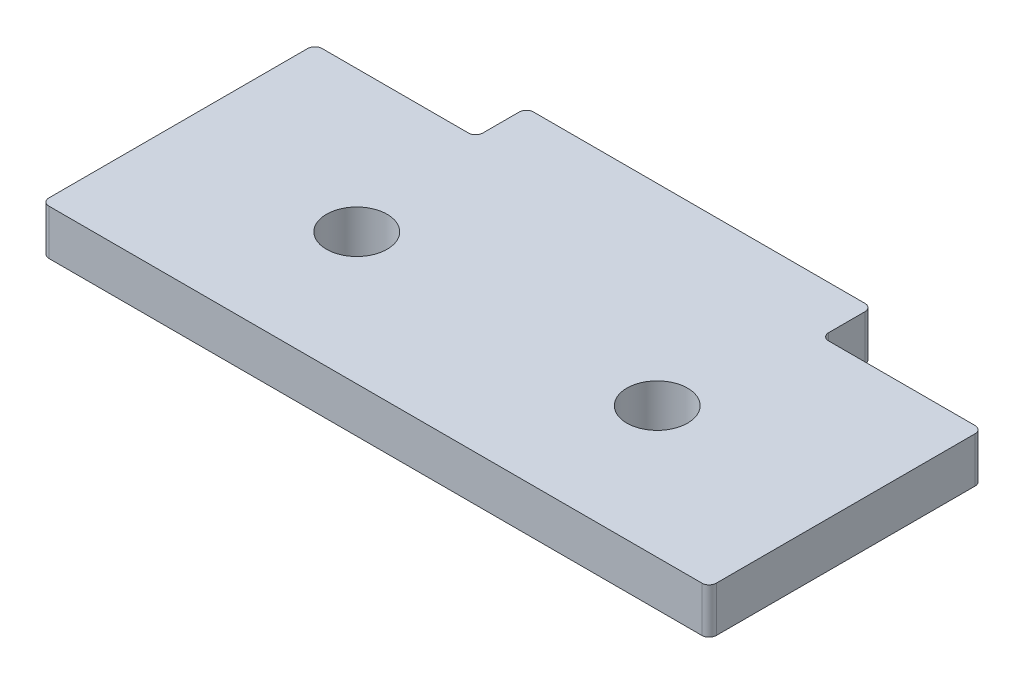
ISO-10303-21;
HEADER;
FILE_DESCRIPTION(('STEP AP214'),'2;1');
FILE_NAME('part.step','',(''),(''),'','','');
FILE_SCHEMA(('AUTOMOTIVE_DESIGN { 1 0 10303 214 1 1 1 1 }'));
ENDSEC;
DATA;
#1=APPLICATION_CONTEXT('core data for automotive mechanical design processes');
#2=APPLICATION_PROTOCOL_DEFINITION('international standard','automotive_design',2000,#1);
#3=PRODUCT_CONTEXT('',#1,'mechanical');
#4=PRODUCT('Part','Part','',(#3));
#5=PRODUCT_RELATED_PRODUCT_CATEGORY('part','',(#4));
#6=PRODUCT_DEFINITION_FORMATION('','',#4);
#7=PRODUCT_DEFINITION_CONTEXT('part definition',#1,'design');
#8=PRODUCT_DEFINITION('design','',#6,#7);
#9=PRODUCT_DEFINITION_SHAPE('','',#8);
#10=(LENGTH_UNIT() NAMED_UNIT(*) SI_UNIT(.MILLI.,.METRE.));
#11=(NAMED_UNIT(*) PLANE_ANGLE_UNIT() SI_UNIT($,.RADIAN.));
#12=(NAMED_UNIT(*) SI_UNIT($,.STERADIAN.) SOLID_ANGLE_UNIT());
#13=UNCERTAINTY_MEASURE_WITH_UNIT(LENGTH_MEASURE(1.E-05),#10,'distance_accuracy_value','');
#14=(GEOMETRIC_REPRESENTATION_CONTEXT(3) GLOBAL_UNCERTAINTY_ASSIGNED_CONTEXT((#13)) GLOBAL_UNIT_ASSIGNED_CONTEXT((#10,
#11,#12)) REPRESENTATION_CONTEXT('',''));
#15=CARTESIAN_POINT('',(0.,0.,0.));
#16=DIRECTION('',(0.,0.,1.));
#17=DIRECTION('',(1.,0.,0.));
#18=AXIS2_PLACEMENT_3D('',#15,#16,#17);
#19=CARTESIAN_POINT('',(-46.7,6.35,22.6606771729786));
#20=DIRECTION('',(0.,0.,-1.));
#21=DIRECTION('',(-1.,0.,0.));
#22=AXIS2_PLACEMENT_3D('',#19,#20,#21);
#23=PLANE('',#22);
#24=DIRECTION('',(1.,0.,0.));
#25=VECTOR('',#24,1.);
#26=CARTESIAN_POINT('',(-46.7,0.,22.6606771729786));
#27=LINE('',#26,#25);
#28=CARTESIAN_POINT('',(-45.7,0.,22.6606771729786));
#29=VERTEX_POINT('',#28);
#30=CARTESIAN_POINT('',(45.7,0.,22.6606771729786));
#31=VERTEX_POINT('',#30);
#32=EDGE_CURVE('E271',#29,#31,#27,.T.);
#33=ORIENTED_EDGE('',*,*,#32,.T.);
#34=DIRECTION('',(0.,-1.,0.));
#35=VECTOR('',#34,1.);
#36=CARTESIAN_POINT('',(45.7,6.35,22.6606771729786));
#37=LINE('',#36,#35);
#38=CARTESIAN_POINT('',(45.7,6.35,22.6606771729786));
#39=VERTEX_POINT('',#38);
#40=EDGE_CURVE('E228',#31,#39,#37,.F.);
#41=ORIENTED_EDGE('',*,*,#40,.T.);
#42=DIRECTION('',(1.,0.,0.));
#43=VECTOR('',#42,1.);
#44=CARTESIAN_POINT('',(-46.7,6.35,22.6606771729786));
#45=LINE('',#44,#43);
#46=CARTESIAN_POINT('',(-45.7,6.35,22.6606771729786));
#47=VERTEX_POINT('',#46);
#48=EDGE_CURVE('E191',#47,#39,#45,.T.);
#49=ORIENTED_EDGE('',*,*,#48,.F.);
#50=DIRECTION('',(0.,-1.,0.));
#51=VECTOR('',#50,1.);
#52=CARTESIAN_POINT('',(-45.7,6.35,22.6606771729786));
#53=LINE('',#52,#51);
#54=EDGE_CURVE('E225',#47,#29,#53,.T.);
#55=ORIENTED_EDGE('',*,*,#54,.T.);
#56=EDGE_LOOP('',(#33,#41,#49,#55));
#57=FACE_BOUND('',#56,.T.);
#58=ADVANCED_FACE('F36',(#57),#23,.F.);
#59=CARTESIAN_POINT('',(46.7,6.35,22.6606771729786));
#60=DIRECTION('',(-1.,0.,0.));
#61=DIRECTION('',(0.,0.,1.));
#62=AXIS2_PLACEMENT_3D('',#59,#60,#61);
#63=PLANE('',#62);
#64=DIRECTION('',(0.,0.,-1.));
#65=VECTOR('',#64,1.);
#66=CARTESIAN_POINT('',(46.7,0.,22.6606771729786));
#67=LINE('',#66,#65);
#68=CARTESIAN_POINT('',(46.7,0.,21.6606771729786));
#69=VERTEX_POINT('',#68);
#70=CARTESIAN_POINT('',(46.7,0.,-14.5606771729786));
#71=VERTEX_POINT('',#70);
#72=EDGE_CURVE('E274',#69,#71,#67,.T.);
#73=ORIENTED_EDGE('',*,*,#72,.T.);
#74=DIRECTION('',(0.,-1.,0.));
#75=VECTOR('',#74,1.);
#76=CARTESIAN_POINT('',(46.7,6.35,-14.5606771729786));
#77=LINE('',#76,#75);
#78=CARTESIAN_POINT('',(46.7,6.35,-14.5606771729786));
#79=VERTEX_POINT('',#78);
#80=EDGE_CURVE('E223',#71,#79,#77,.F.);
#81=ORIENTED_EDGE('',*,*,#80,.T.);
#82=DIRECTION('',(0.,0.,-1.));
#83=VECTOR('',#82,1.);
#84=CARTESIAN_POINT('',(46.7,6.35,22.6606771729786));
#85=LINE('',#84,#83);
#86=CARTESIAN_POINT('',(46.7,6.35,21.6606771729786));
#87=VERTEX_POINT('',#86);
#88=EDGE_CURVE('E295',#87,#79,#85,.T.);
#89=ORIENTED_EDGE('',*,*,#88,.F.);
#90=DIRECTION('',(0.,-1.,0.));
#91=VECTOR('',#90,1.);
#92=CARTESIAN_POINT('',(46.7,6.35,21.6606771729786));
#93=LINE('',#92,#91);
#94=EDGE_CURVE('E220',#87,#69,#93,.T.);
#95=ORIENTED_EDGE('',*,*,#94,.T.);
#96=EDGE_LOOP('',(#73,#81,#89,#95));
#97=FACE_BOUND('',#96,.T.);
#98=ADVANCED_FACE('F338',(#97),#63,.F.);
#99=CARTESIAN_POINT('',(46.7,6.35,-15.5606771729786));
#100=DIRECTION('',(0.,0.,1.));
#101=DIRECTION('',(1.,0.,0.));
#102=AXIS2_PLACEMENT_3D('',#99,#100,#101);
#103=PLANE('',#102);
#104=DIRECTION('',(-1.,0.,0.));
#105=VECTOR('',#104,1.);
#106=CARTESIAN_POINT('',(46.7,0.,-15.5606771729786));
#107=LINE('',#106,#105);
#108=CARTESIAN_POINT('',(45.7,0.,-15.5606771729786));
#109=VERTEX_POINT('',#108);
#110=CARTESIAN_POINT('',(25.2,0.,-15.5606771729786));
#111=VERTEX_POINT('',#110);
#112=EDGE_CURVE('E183',#109,#111,#107,.T.);
#113=ORIENTED_EDGE('',*,*,#112,.T.);
#114=DIRECTION('',(0.,-1.,0.));
#115=VECTOR('',#114,1.);
#116=CARTESIAN_POINT('',(25.2,6.35,-15.5606771729786));
#117=LINE('',#116,#115);
#118=CARTESIAN_POINT('',(25.2,6.35,-15.5606771729786));
#119=VERTEX_POINT('',#118);
#120=EDGE_CURVE('E218',#111,#119,#117,.F.);
#121=ORIENTED_EDGE('',*,*,#120,.T.);
#122=DIRECTION('',(-1.,0.,0.));
#123=VECTOR('',#122,1.);
#124=CARTESIAN_POINT('',(46.7,6.35,-15.5606771729786));
#125=LINE('',#124,#123);
#126=CARTESIAN_POINT('',(45.7,6.35,-15.5606771729786));
#127=VERTEX_POINT('',#126);
#128=EDGE_CURVE('E291',#127,#119,#125,.T.);
#129=ORIENTED_EDGE('',*,*,#128,.F.);
#130=DIRECTION('',(0.,-1.,0.));
#131=VECTOR('',#130,1.);
#132=CARTESIAN_POINT('',(45.7,6.35,-15.5606771729786));
#133=LINE('',#132,#131);
#134=EDGE_CURVE('E215',#127,#109,#133,.T.);
#135=ORIENTED_EDGE('',*,*,#134,.T.);
#136=EDGE_LOOP('',(#113,#121,#129,#135));
#137=FACE_BOUND('',#136,.T.);
#138=ADVANCED_FACE('F281',(#137),#103,.F.);
#139=CARTESIAN_POINT('',(24.2,6.35,-15.5606771729786));
#140=DIRECTION('',(-1.,0.,0.));
#141=DIRECTION('',(0.,0.,1.));
#142=AXIS2_PLACEMENT_3D('',#139,#140,#141);
#143=PLANE('',#142);
#144=DIRECTION('',(0.,0.,-1.));
#145=VECTOR('',#144,1.);
#146=CARTESIAN_POINT('',(24.2,0.,-15.5606771729786));
#147=LINE('',#146,#145);
#148=CARTESIAN_POINT('',(24.2,0.,-16.5606771729786));
#149=VERTEX_POINT('',#148);
#150=CARTESIAN_POINT('',(24.2,0.,-21.6606771729786));
#151=VERTEX_POINT('',#150);
#152=EDGE_CURVE('E178',#149,#151,#147,.T.);
#153=ORIENTED_EDGE('',*,*,#152,.T.);
#154=DIRECTION('',(0.,-1.,0.));
#155=VECTOR('',#154,1.);
#156=CARTESIAN_POINT('',(24.2,6.35,-21.6606771729786));
#157=LINE('',#156,#155);
#158=CARTESIAN_POINT('',(24.2,6.35,-21.6606771729786));
#159=VERTEX_POINT('',#158);
#160=EDGE_CURVE('E155',#151,#159,#157,.F.);
#161=ORIENTED_EDGE('',*,*,#160,.T.);
#162=DIRECTION('',(0.,0.,-1.));
#163=VECTOR('',#162,1.);
#164=CARTESIAN_POINT('',(24.2,6.35,-15.5606771729786));
#165=LINE('',#164,#163);
#166=CARTESIAN_POINT('',(24.2,6.35,-16.5606771729786));
#167=VERTEX_POINT('',#166);
#168=EDGE_CURVE('E290',#167,#159,#165,.T.);
#169=ORIENTED_EDGE('',*,*,#168,.F.);
#170=DIRECTION('',(0.,-1.,0.));
#171=VECTOR('',#170,1.);
#172=CARTESIAN_POINT('',(24.2,0.,-16.5606771729786));
#173=LINE('',#172,#171);
#174=EDGE_CURVE('E160',#167,#149,#173,.T.);
#175=ORIENTED_EDGE('',*,*,#174,.T.);
#176=EDGE_LOOP('',(#153,#161,#169,#175));
#177=FACE_BOUND('',#176,.T.);
#178=ADVANCED_FACE('F293',(#177),#143,.F.);
#179=CARTESIAN_POINT('',(24.2,6.35,-22.6606771729786));
#180=DIRECTION('',(0.,0.,1.));
#181=DIRECTION('',(1.,0.,0.));
#182=AXIS2_PLACEMENT_3D('',#179,#180,#181);
#183=PLANE('',#182);
#184=DIRECTION('',(-1.,0.,0.));
#185=VECTOR('',#184,1.);
#186=CARTESIAN_POINT('',(24.2,6.35,-22.6606771729786));
#187=LINE('',#186,#185);
#188=CARTESIAN_POINT('',(23.2,6.35,-22.6606771729786));
#189=VERTEX_POINT('',#188);
#190=CARTESIAN_POINT('',(-23.2,6.35,-22.6606771729786));
#191=VERTEX_POINT('',#190);
#192=EDGE_CURVE('E170',#189,#191,#187,.T.);
#193=ORIENTED_EDGE('',*,*,#192,.F.);
#194=DIRECTION('',(0.,-1.,0.));
#195=VECTOR('',#194,1.);
#196=CARTESIAN_POINT('',(23.2,6.35,-22.6606771729786));
#197=LINE('',#196,#195);
#198=CARTESIAN_POINT('',(23.2,0.,-22.6606771729786));
#199=VERTEX_POINT('',#198);
#200=EDGE_CURVE('E154',#189,#199,#197,.T.);
#201=ORIENTED_EDGE('',*,*,#200,.T.);
#202=DIRECTION('',(-1.,0.,0.));
#203=VECTOR('',#202,1.);
#204=CARTESIAN_POINT('',(24.2,0.,-22.6606771729786));
#205=LINE('',#204,#203);
#206=CARTESIAN_POINT('',(-23.2,0.,-22.6606771729786));
#207=VERTEX_POINT('',#206);
#208=EDGE_CURVE('E167',#199,#207,#205,.T.);
#209=ORIENTED_EDGE('',*,*,#208,.T.);
#210=DIRECTION('',(0.,-1.,0.));
#211=VECTOR('',#210,1.);
#212=CARTESIAN_POINT('',(-23.2,6.35,-22.6606771729786));
#213=LINE('',#212,#211);
#214=EDGE_CURVE('E172',#207,#191,#213,.F.);
#215=ORIENTED_EDGE('',*,*,#214,.T.);
#216=EDGE_LOOP('',(#193,#201,#209,#215));
#217=FACE_BOUND('',#216,.T.);
#218=ADVANCED_FACE('F166',(#217),#183,.F.);
#219=CARTESIAN_POINT('',(-24.2,6.35,-22.6606771729786));
#220=DIRECTION('',(1.,0.,0.));
#221=DIRECTION('',(0.,0.,-1.));
#222=AXIS2_PLACEMENT_3D('',#219,#220,#221);
#223=PLANE('',#222);
#224=DIRECTION('',(0.,0.,1.));
#225=VECTOR('',#224,1.);
#226=CARTESIAN_POINT('',(-24.2,6.35,-22.6606771729786));
#227=LINE('',#226,#225);
#228=CARTESIAN_POINT('',(-24.2,6.35,-21.6606771729786));
#229=VERTEX_POINT('',#228);
#230=CARTESIAN_POINT('',(-24.2,6.35,-16.5606771729786));
#231=VERTEX_POINT('',#230);
#232=EDGE_CURVE('E262',#229,#231,#227,.T.);
#233=ORIENTED_EDGE('',*,*,#232,.F.);
#234=DIRECTION('',(0.,-1.,0.));
#235=VECTOR('',#234,1.);
#236=CARTESIAN_POINT('',(-24.2,6.35,-21.6606771729786));
#237=LINE('',#236,#235);
#238=CARTESIAN_POINT('',(-24.2,0.,-21.6606771729786));
#239=VERTEX_POINT('',#238);
#240=EDGE_CURVE('E236',#229,#239,#237,.T.);
#241=ORIENTED_EDGE('',*,*,#240,.T.);
#242=DIRECTION('',(0.,0.,1.));
#243=VECTOR('',#242,1.);
#244=CARTESIAN_POINT('',(-24.2,0.,-22.6606771729786));
#245=LINE('',#244,#243);
#246=CARTESIAN_POINT('',(-24.2,0.,-16.5606771729786));
#247=VERTEX_POINT('',#246);
#248=EDGE_CURVE('E177',#239,#247,#245,.T.);
#249=ORIENTED_EDGE('',*,*,#248,.T.);
#250=DIRECTION('',(0.,-1.,0.));
#251=VECTOR('',#250,1.);
#252=CARTESIAN_POINT('',(-24.2,6.35,-16.5606771729786));
#253=LINE('',#252,#251);
#254=EDGE_CURVE('E234',#247,#231,#253,.F.);
#255=ORIENTED_EDGE('',*,*,#254,.T.);
#256=EDGE_LOOP('',(#233,#241,#249,#255));
#257=FACE_BOUND('',#256,.T.);
#258=ADVANCED_FACE('F253',(#257),#223,.F.);
#259=CARTESIAN_POINT('',(-24.2,6.35,-15.5606771729786));
#260=DIRECTION('',(0.,0.,1.));
#261=DIRECTION('',(1.,0.,0.));
#262=AXIS2_PLACEMENT_3D('',#259,#260,#261);
#263=PLANE('',#262);
#264=DIRECTION('',(-1.,0.,0.));
#265=VECTOR('',#264,1.);
#266=CARTESIAN_POINT('',(-24.2,6.35,-15.5606771729786));
#267=LINE('',#266,#265);
#268=CARTESIAN_POINT('',(-25.2,6.35,-15.5606771729786));
#269=VERTEX_POINT('',#268);
#270=CARTESIAN_POINT('',(-45.7,6.35,-15.5606771729786));
#271=VERTEX_POINT('',#270);
#272=EDGE_CURVE('E261',#269,#271,#267,.T.);
#273=ORIENTED_EDGE('',*,*,#272,.F.);
#274=DIRECTION('',(0.,-1.,0.));
#275=VECTOR('',#274,1.);
#276=CARTESIAN_POINT('',(-25.2,0.,-15.5606771729786));
#277=LINE('',#276,#275);
#278=CARTESIAN_POINT('',(-25.2,0.,-15.5606771729786));
#279=VERTEX_POINT('',#278);
#280=EDGE_CURVE('E241',#269,#279,#277,.T.);
#281=ORIENTED_EDGE('',*,*,#280,.T.);
#282=DIRECTION('',(-1.,0.,0.));
#283=VECTOR('',#282,1.);
#284=CARTESIAN_POINT('',(-24.2,0.,-15.5606771729786));
#285=LINE('',#284,#283);
#286=CARTESIAN_POINT('',(-45.7,0.,-15.5606771729786));
#287=VERTEX_POINT('',#286);
#288=EDGE_CURVE('E181',#279,#287,#285,.T.);
#289=ORIENTED_EDGE('',*,*,#288,.T.);
#290=DIRECTION('',(0.,-1.,0.));
#291=VECTOR('',#290,1.);
#292=CARTESIAN_POINT('',(-45.7,6.35,-15.5606771729786));
#293=LINE('',#292,#291);
#294=EDGE_CURVE('E239',#287,#271,#293,.F.);
#295=ORIENTED_EDGE('',*,*,#294,.T.);
#296=EDGE_LOOP('',(#273,#281,#289,#295));
#297=FACE_BOUND('',#296,.T.);
#298=ADVANCED_FACE('F264',(#297),#263,.F.);
#299=CARTESIAN_POINT('',(-46.7,6.35,-15.5606771729786));
#300=DIRECTION('',(1.,0.,0.));
#301=DIRECTION('',(0.,0.,-1.));
#302=AXIS2_PLACEMENT_3D('',#299,#300,#301);
#303=PLANE('',#302);
#304=DIRECTION('',(0.,0.,1.));
#305=VECTOR('',#304,1.);
#306=CARTESIAN_POINT('',(-46.7,0.,-15.5606771729786));
#307=LINE('',#306,#305);
#308=CARTESIAN_POINT('',(-46.7,0.,-14.5606771729786));
#309=VERTEX_POINT('',#308);
#310=CARTESIAN_POINT('',(-46.7,0.,21.6606771729786));
#311=VERTEX_POINT('',#310);
#312=EDGE_CURVE('E189',#309,#311,#307,.T.);
#313=ORIENTED_EDGE('',*,*,#312,.T.);
#314=DIRECTION('',(0.,-1.,0.));
#315=VECTOR('',#314,1.);
#316=CARTESIAN_POINT('',(-46.7,6.35,21.6606771729786));
#317=LINE('',#316,#315);
#318=CARTESIAN_POINT('',(-46.7,6.35,21.6606771729786));
#319=VERTEX_POINT('',#318);
#320=EDGE_CURVE('E51',#311,#319,#317,.F.);
#321=ORIENTED_EDGE('',*,*,#320,.T.);
#322=DIRECTION('',(0.,0.,1.));
#323=VECTOR('',#322,1.);
#324=CARTESIAN_POINT('',(-46.7,6.35,-15.5606771729786));
#325=LINE('',#324,#323);
#326=CARTESIAN_POINT('',(-46.7,6.35,-14.5606771729786));
#327=VERTEX_POINT('',#326);
#328=EDGE_CURVE('E192',#327,#319,#325,.T.);
#329=ORIENTED_EDGE('',*,*,#328,.F.);
#330=DIRECTION('',(0.,-1.,0.));
#331=VECTOR('',#330,1.);
#332=CARTESIAN_POINT('',(-46.7,6.35,-14.5606771729786));
#333=LINE('',#332,#331);
#334=EDGE_CURVE('E230',#327,#309,#333,.T.);
#335=ORIENTED_EDGE('',*,*,#334,.T.);
#336=EDGE_LOOP('',(#313,#321,#329,#335));
#337=FACE_BOUND('',#336,.T.);
#338=ADVANCED_FACE('F325',(#337),#303,.F.);
#339=CARTESIAN_POINT('',(0.,6.35,0.));
#340=DIRECTION('',(0.,1.,0.));
#341=DIRECTION('',(0.,0.,1.));
#342=AXIS2_PLACEMENT_3D('',#339,#340,#341);
#343=PLANE('',#342);
#344=CARTESIAN_POINT('',(-21.05,6.35,4.2252414580564));
#345=DIRECTION('',(0.,1.,0.));
#346=DIRECTION('',(0.,0.,1.));
#347=AXIS2_PLACEMENT_3D('',#344,#345,#346);
#348=CIRCLE('',#347,4.25);
#349=CARTESIAN_POINT('',(-21.05,6.35,8.47524145805641));
#350=VERTEX_POINT('',#349);
#351=EDGE_CURVE('E308',#350,#350,#348,.T.);
#352=ORIENTED_EDGE('',*,*,#351,.F.);
#353=EDGE_LOOP('',(#352));
#354=FACE_BOUND('',#353,.T.);
#355=CARTESIAN_POINT('',(21.05,6.35,4.27524145805494));
#356=DIRECTION('',(0.,1.,0.));
#357=DIRECTION('',(0.,0.,1.));
#358=AXIS2_PLACEMENT_3D('',#355,#356,#357);
#359=CIRCLE('',#358,4.25);
#360=CARTESIAN_POINT('',(21.05,6.35,8.52524145805494));
#361=VERTEX_POINT('',#360);
#362=EDGE_CURVE('E302',#361,#361,#359,.T.);
#363=ORIENTED_EDGE('',*,*,#362,.F.);
#364=EDGE_LOOP('',(#363));
#365=FACE_BOUND('',#364,.T.);
#366=ORIENTED_EDGE('',*,*,#168,.T.);
#367=CARTESIAN_POINT('',(23.2,6.35,-21.6606771729786));
#368=DIRECTION('',(0.,1.,0.));
#369=DIRECTION('',(0.,0.,1.));
#370=AXIS2_PLACEMENT_3D('',#367,#368,#369);
#371=CIRCLE('',#370,1.);
#372=EDGE_CURVE('E213',#159,#189,#371,.T.);
#373=ORIENTED_EDGE('',*,*,#372,.T.);
#374=ORIENTED_EDGE('',*,*,#192,.T.);
#375=CARTESIAN_POINT('',(-23.2,6.35,-21.6606771729786));
#376=DIRECTION('',(0.,1.,0.));
#377=DIRECTION('',(0.,0.,1.));
#378=AXIS2_PLACEMENT_3D('',#375,#376,#377);
#379=CIRCLE('',#378,1.);
#380=EDGE_CURVE('E205',#191,#229,#379,.T.);
#381=ORIENTED_EDGE('',*,*,#380,.T.);
#382=ORIENTED_EDGE('',*,*,#232,.T.);
#383=CARTESIAN_POINT('',(-25.2,6.35,-16.5606771729786));
#384=DIRECTION('',(0.,1.,0.));
#385=DIRECTION('',(0.,0.,1.));
#386=AXIS2_PLACEMENT_3D('',#383,#384,#385);
#387=CIRCLE('',#386,1.);
#388=EDGE_CURVE('E11',#231,#269,#387,.F.);
#389=ORIENTED_EDGE('',*,*,#388,.T.);
#390=ORIENTED_EDGE('',*,*,#272,.T.);
#391=CARTESIAN_POINT('',(-45.7,6.35,-14.5606771729786));
#392=DIRECTION('',(0.,1.,0.));
#393=DIRECTION('',(0.,0.,1.));
#394=AXIS2_PLACEMENT_3D('',#391,#392,#393);
#395=CIRCLE('',#394,1.);
#396=EDGE_CURVE('E58',#271,#327,#395,.T.);
#397=ORIENTED_EDGE('',*,*,#396,.T.);
#398=ORIENTED_EDGE('',*,*,#328,.T.);
#399=CARTESIAN_POINT('',(-45.7,6.35,21.6606771729786));
#400=DIRECTION('',(0.,1.,0.));
#401=DIRECTION('',(0.,0.,1.));
#402=AXIS2_PLACEMENT_3D('',#399,#400,#401);
#403=CIRCLE('',#402,1.);
#404=EDGE_CURVE('E207',#319,#47,#403,.T.);
#405=ORIENTED_EDGE('',*,*,#404,.T.);
#406=ORIENTED_EDGE('',*,*,#48,.T.);
#407=CARTESIAN_POINT('',(45.7,6.35,21.6606771729786));
#408=DIRECTION('',(0.,1.,0.));
#409=DIRECTION('',(0.,0.,1.));
#410=AXIS2_PLACEMENT_3D('',#407,#408,#409);
#411=CIRCLE('',#410,1.);
#412=EDGE_CURVE('E209',#39,#87,#411,.T.);
#413=ORIENTED_EDGE('',*,*,#412,.T.);
#414=ORIENTED_EDGE('',*,*,#88,.T.);
#415=CARTESIAN_POINT('',(45.7,6.35,-14.5606771729786));
#416=DIRECTION('',(0.,1.,0.));
#417=DIRECTION('',(0.,0.,1.));
#418=AXIS2_PLACEMENT_3D('',#415,#416,#417);
#419=CIRCLE('',#418,1.);
#420=EDGE_CURVE('E211',#79,#127,#419,.T.);
#421=ORIENTED_EDGE('',*,*,#420,.T.);
#422=ORIENTED_EDGE('',*,*,#128,.T.);
#423=CARTESIAN_POINT('',(25.2,6.35,-16.5606771729786));
#424=DIRECTION('',(0.,1.,0.));
#425=DIRECTION('',(0.,0.,1.));
#426=AXIS2_PLACEMENT_3D('',#423,#424,#425);
#427=CIRCLE('',#426,1.);
#428=EDGE_CURVE('E246',#119,#167,#427,.F.);
#429=ORIENTED_EDGE('',*,*,#428,.T.);
#430=EDGE_LOOP('',(#366,#373,#374,#381,#382,#389,#390,#397,#398,#405,#406,#413,#414,#421,#422,#429));
#431=FACE_BOUND('',#430,.T.);
#432=ADVANCED_FACE('F260',(#354,#365,#431),#343,.T.);
#433=CARTESIAN_POINT('',(0.,0.,0.));
#434=DIRECTION('',(0.,1.,0.));
#435=DIRECTION('',(0.,0.,1.));
#436=AXIS2_PLACEMENT_3D('',#433,#434,#435);
#437=PLANE('',#436);
#438=CARTESIAN_POINT('',(-21.05,0.,4.2252414580564));
#439=DIRECTION('',(0.,1.,0.));
#440=DIRECTION('',(0.,0.,1.));
#441=AXIS2_PLACEMENT_3D('',#438,#439,#440);
#442=CIRCLE('',#441,4.25);
#443=CARTESIAN_POINT('',(-21.05,0.,8.47524145805641));
#444=VERTEX_POINT('',#443);
#445=EDGE_CURVE('E275',#444,#444,#442,.T.);
#446=ORIENTED_EDGE('',*,*,#445,.T.);
#447=EDGE_LOOP('',(#446));
#448=FACE_BOUND('',#447,.T.);
#449=CARTESIAN_POINT('',(21.05,0.,4.27524145805494));
#450=DIRECTION('',(0.,1.,0.));
#451=DIRECTION('',(0.,0.,1.));
#452=AXIS2_PLACEMENT_3D('',#449,#450,#451);
#453=CIRCLE('',#452,4.25);
#454=CARTESIAN_POINT('',(21.05,0.,8.52524145805494));
#455=VERTEX_POINT('',#454);
#456=EDGE_CURVE('E305',#455,#455,#453,.T.);
#457=ORIENTED_EDGE('',*,*,#456,.T.);
#458=EDGE_LOOP('',(#457));
#459=FACE_BOUND('',#458,.T.);
#460=ORIENTED_EDGE('',*,*,#208,.F.);
#461=CARTESIAN_POINT('',(23.2,0.,-21.6606771729786));
#462=DIRECTION('',(0.,1.,0.));
#463=DIRECTION('',(0.,0.,1.));
#464=AXIS2_PLACEMENT_3D('',#461,#462,#463);
#465=CIRCLE('',#464,1.);
#466=EDGE_CURVE('E150',#199,#151,#465,.F.);
#467=ORIENTED_EDGE('',*,*,#466,.T.);
#468=ORIENTED_EDGE('',*,*,#152,.F.);
#469=CARTESIAN_POINT('',(25.2,0.,-16.5606771729786));
#470=DIRECTION('',(0.,1.,0.));
#471=DIRECTION('',(0.,0.,1.));
#472=AXIS2_PLACEMENT_3D('',#469,#470,#471);
#473=CIRCLE('',#472,1.);
#474=EDGE_CURVE('E244',#149,#111,#473,.T.);
#475=ORIENTED_EDGE('',*,*,#474,.T.);
#476=ORIENTED_EDGE('',*,*,#112,.F.);
#477=CARTESIAN_POINT('',(45.7,0.,-14.5606771729786));
#478=DIRECTION('',(0.,1.,0.));
#479=DIRECTION('',(0.,0.,1.));
#480=AXIS2_PLACEMENT_3D('',#477,#478,#479);
#481=CIRCLE('',#480,1.);
#482=EDGE_CURVE('E161',#109,#71,#481,.F.);
#483=ORIENTED_EDGE('',*,*,#482,.T.);
#484=ORIENTED_EDGE('',*,*,#72,.F.);
#485=CARTESIAN_POINT('',(45.7,0.,21.6606771729786));
#486=DIRECTION('',(0.,1.,0.));
#487=DIRECTION('',(0.,0.,1.));
#488=AXIS2_PLACEMENT_3D('',#485,#486,#487);
#489=CIRCLE('',#488,1.);
#490=EDGE_CURVE('E198',#69,#31,#489,.F.);
#491=ORIENTED_EDGE('',*,*,#490,.T.);
#492=ORIENTED_EDGE('',*,*,#32,.F.);
#493=CARTESIAN_POINT('',(-45.7,0.,21.6606771729786));
#494=DIRECTION('',(0.,1.,0.));
#495=DIRECTION('',(0.,0.,1.));
#496=AXIS2_PLACEMENT_3D('',#493,#494,#495);
#497=CIRCLE('',#496,1.);
#498=EDGE_CURVE('E196',#29,#311,#497,.F.);
#499=ORIENTED_EDGE('',*,*,#498,.T.);
#500=ORIENTED_EDGE('',*,*,#312,.F.);
#501=CARTESIAN_POINT('',(-45.7,0.,-14.5606771729786));
#502=DIRECTION('',(0.,1.,0.));
#503=DIRECTION('',(0.,0.,1.));
#504=AXIS2_PLACEMENT_3D('',#501,#502,#503);
#505=CIRCLE('',#504,1.);
#506=EDGE_CURVE('E171',#309,#287,#505,.F.);
#507=ORIENTED_EDGE('',*,*,#506,.T.);
#508=ORIENTED_EDGE('',*,*,#288,.F.);
#509=CARTESIAN_POINT('',(-25.2,0.,-16.5606771729786));
#510=DIRECTION('',(0.,1.,0.));
#511=DIRECTION('',(0.,0.,1.));
#512=AXIS2_PLACEMENT_3D('',#509,#510,#511);
#513=CIRCLE('',#512,1.);
#514=EDGE_CURVE('E44',#279,#247,#513,.T.);
#515=ORIENTED_EDGE('',*,*,#514,.T.);
#516=ORIENTED_EDGE('',*,*,#248,.F.);
#517=CARTESIAN_POINT('',(-23.2,0.,-21.6606771729786));
#518=DIRECTION('',(0.,1.,0.));
#519=DIRECTION('',(0.,0.,1.));
#520=AXIS2_PLACEMENT_3D('',#517,#518,#519);
#521=CIRCLE('',#520,1.);
#522=EDGE_CURVE('E176',#239,#207,#521,.F.);
#523=ORIENTED_EDGE('',*,*,#522,.T.);
#524=EDGE_LOOP('',(#460,#467,#468,#475,#476,#483,#484,#491,#492,#499,#500,#507,#508,#515,#516,#523));
#525=FACE_BOUND('',#524,.T.);
#526=ADVANCED_FACE('F174',(#448,#459,#525),#437,.F.);
#527=CARTESIAN_POINT('',(21.05,0.,4.27524145805494));
#528=DIRECTION('',(0.,1.,0.));
#529=DIRECTION('',(0.,0.,1.));
#530=AXIS2_PLACEMENT_3D('',#527,#528,#529);
#531=CYLINDRICAL_SURFACE('',#530,4.25);
#532=ORIENTED_EDGE('',*,*,#456,.F.);
#533=EDGE_LOOP('',(#532));
#534=FACE_BOUND('',#533,.T.);
#535=ORIENTED_EDGE('',*,*,#362,.T.);
#536=EDGE_LOOP('',(#535));
#537=FACE_BOUND('',#536,.T.);
#538=ADVANCED_FACE('F319',(#534,#537),#531,.F.);
#539=CARTESIAN_POINT('',(-21.05,0.,4.2252414580564));
#540=DIRECTION('',(0.,1.,0.));
#541=DIRECTION('',(0.,0.,1.));
#542=AXIS2_PLACEMENT_3D('',#539,#540,#541);
#543=CYLINDRICAL_SURFACE('',#542,4.25);
#544=ORIENTED_EDGE('',*,*,#445,.F.);
#545=EDGE_LOOP('',(#544));
#546=FACE_BOUND('',#545,.T.);
#547=ORIENTED_EDGE('',*,*,#351,.T.);
#548=EDGE_LOOP('',(#547));
#549=FACE_BOUND('',#548,.T.);
#550=ADVANCED_FACE('F316',(#546,#549),#543,.F.);
#551=CARTESIAN_POINT('',(23.2,6.35,-21.6606771729786));
#552=DIRECTION('',(0.,-1.,0.));
#553=DIRECTION('',(0.,0.,-1.));
#554=AXIS2_PLACEMENT_3D('',#551,#552,#553);
#555=CYLINDRICAL_SURFACE('',#554,1.);
#556=ORIENTED_EDGE('',*,*,#372,.F.);
#557=ORIENTED_EDGE('',*,*,#160,.F.);
#558=ORIENTED_EDGE('',*,*,#466,.F.);
#559=ORIENTED_EDGE('',*,*,#200,.F.);
#560=EDGE_LOOP('',(#556,#557,#558,#559));
#561=FACE_BOUND('',#560,.T.);
#562=ADVANCED_FACE('F153',(#561),#555,.T.);
#563=CARTESIAN_POINT('',(25.2,6.35,-16.5606771729786));
#564=DIRECTION('',(0.,1.,0.));
#565=DIRECTION('',(0.,0.,1.));
#566=AXIS2_PLACEMENT_3D('',#563,#564,#565);
#567=CYLINDRICAL_SURFACE('',#566,1.);
#568=ORIENTED_EDGE('',*,*,#428,.F.);
#569=ORIENTED_EDGE('',*,*,#120,.F.);
#570=ORIENTED_EDGE('',*,*,#474,.F.);
#571=ORIENTED_EDGE('',*,*,#174,.F.);
#572=EDGE_LOOP('',(#568,#569,#570,#571));
#573=FACE_BOUND('',#572,.T.);
#574=ADVANCED_FACE('F287',(#573),#567,.F.);
#575=CARTESIAN_POINT('',(45.7,6.35,-14.5606771729786));
#576=DIRECTION('',(0.,-1.,0.));
#577=DIRECTION('',(0.,0.,-1.));
#578=AXIS2_PLACEMENT_3D('',#575,#576,#577);
#579=CYLINDRICAL_SURFACE('',#578,1.);
#580=ORIENTED_EDGE('',*,*,#420,.F.);
#581=ORIENTED_EDGE('',*,*,#80,.F.);
#582=ORIENTED_EDGE('',*,*,#482,.F.);
#583=ORIENTED_EDGE('',*,*,#134,.F.);
#584=EDGE_LOOP('',(#580,#581,#582,#583));
#585=FACE_BOUND('',#584,.T.);
#586=ADVANCED_FACE('F352',(#585),#579,.T.);
#587=CARTESIAN_POINT('',(45.7,6.35,21.6606771729786));
#588=DIRECTION('',(0.,-1.,0.));
#589=DIRECTION('',(0.,0.,-1.));
#590=AXIS2_PLACEMENT_3D('',#587,#588,#589);
#591=CYLINDRICAL_SURFACE('',#590,1.);
#592=ORIENTED_EDGE('',*,*,#412,.F.);
#593=ORIENTED_EDGE('',*,*,#40,.F.);
#594=ORIENTED_EDGE('',*,*,#490,.F.);
#595=ORIENTED_EDGE('',*,*,#94,.F.);
#596=EDGE_LOOP('',(#592,#593,#594,#595));
#597=FACE_BOUND('',#596,.T.);
#598=ADVANCED_FACE('F355',(#597),#591,.T.);
#599=CARTESIAN_POINT('',(-45.7,6.35,21.6606771729786));
#600=DIRECTION('',(0.,-1.,0.));
#601=DIRECTION('',(0.,0.,-1.));
#602=AXIS2_PLACEMENT_3D('',#599,#600,#601);
#603=CYLINDRICAL_SURFACE('',#602,1.);
#604=ORIENTED_EDGE('',*,*,#404,.F.);
#605=ORIENTED_EDGE('',*,*,#320,.F.);
#606=ORIENTED_EDGE('',*,*,#498,.F.);
#607=ORIENTED_EDGE('',*,*,#54,.F.);
#608=EDGE_LOOP('',(#604,#605,#606,#607));
#609=FACE_BOUND('',#608,.T.);
#610=ADVANCED_FACE('F359',(#609),#603,.T.);
#611=CARTESIAN_POINT('',(-23.2,6.35,-21.6606771729786));
#612=DIRECTION('',(0.,-1.,0.));
#613=DIRECTION('',(0.,0.,-1.));
#614=AXIS2_PLACEMENT_3D('',#611,#612,#613);
#615=CYLINDRICAL_SURFACE('',#614,1.);
#616=ORIENTED_EDGE('',*,*,#380,.F.);
#617=ORIENTED_EDGE('',*,*,#214,.F.);
#618=ORIENTED_EDGE('',*,*,#522,.F.);
#619=ORIENTED_EDGE('',*,*,#240,.F.);
#620=EDGE_LOOP('',(#616,#617,#618,#619));
#621=FACE_BOUND('',#620,.T.);
#622=ADVANCED_FACE('F363',(#621),#615,.T.);
#623=CARTESIAN_POINT('',(-25.2,6.35,-16.5606771729786));
#624=DIRECTION('',(0.,1.,0.));
#625=DIRECTION('',(0.,0.,1.));
#626=AXIS2_PLACEMENT_3D('',#623,#624,#625);
#627=CYLINDRICAL_SURFACE('',#626,1.);
#628=ORIENTED_EDGE('',*,*,#388,.F.);
#629=ORIENTED_EDGE('',*,*,#254,.F.);
#630=ORIENTED_EDGE('',*,*,#514,.F.);
#631=ORIENTED_EDGE('',*,*,#280,.F.);
#632=EDGE_LOOP('',(#628,#629,#630,#631));
#633=FACE_BOUND('',#632,.T.);
#634=ADVANCED_FACE('F257',(#633),#627,.F.);
#635=CARTESIAN_POINT('',(-45.7,6.35,-14.5606771729786));
#636=DIRECTION('',(0.,-1.,0.));
#637=DIRECTION('',(0.,0.,-1.));
#638=AXIS2_PLACEMENT_3D('',#635,#636,#637);
#639=CYLINDRICAL_SURFACE('',#638,1.);
#640=ORIENTED_EDGE('',*,*,#396,.F.);
#641=ORIENTED_EDGE('',*,*,#294,.F.);
#642=ORIENTED_EDGE('',*,*,#506,.F.);
#643=ORIENTED_EDGE('',*,*,#334,.F.);
#644=EDGE_LOOP('',(#640,#641,#642,#643));
#645=FACE_BOUND('',#644,.T.);
#646=ADVANCED_FACE('F38',(#645),#639,.T.);
#647=CLOSED_SHELL('',(#58,#98,#138,#178,#218,#258,#298,#338,#432,#526,#538,#550,#562,#574,#586,
#598,#610,#622,#634,#646));
#648=MANIFOLD_SOLID_BREP('B2',#647);
#649=ADVANCED_BREP_SHAPE_REPRESENTATION('',(#18,#648),#14);
#650=SHAPE_DEFINITION_REPRESENTATION(#9,#649);
ENDSEC;
END-ISO-10303-21;
